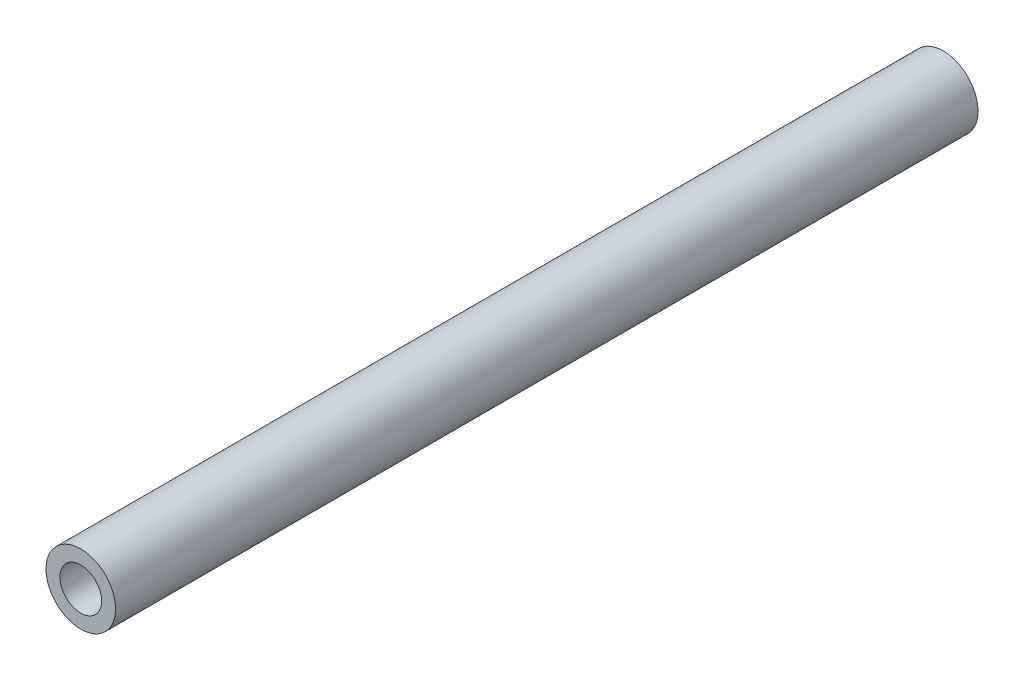
ISO-10303-21;
HEADER;
FILE_DESCRIPTION(('STEP AP214'),'2;1');
FILE_NAME('part.step','',(''),(''),'','','');
FILE_SCHEMA(('AUTOMOTIVE_DESIGN { 1 0 10303 214 1 1 1 1 }'));
ENDSEC;
DATA;
#1=APPLICATION_CONTEXT('core data for automotive mechanical design processes');
#2=APPLICATION_PROTOCOL_DEFINITION('international standard','automotive_design',2000,#1);
#3=PRODUCT_CONTEXT('',#1,'mechanical');
#4=PRODUCT('Part','Part','',(#3));
#5=PRODUCT_RELATED_PRODUCT_CATEGORY('part','',(#4));
#6=PRODUCT_DEFINITION_FORMATION('','',#4);
#7=PRODUCT_DEFINITION_CONTEXT('part definition',#1,'design');
#8=PRODUCT_DEFINITION('design','',#6,#7);
#9=PRODUCT_DEFINITION_SHAPE('','',#8);
#10=(LENGTH_UNIT() NAMED_UNIT(*) SI_UNIT(.MILLI.,.METRE.));
#11=(NAMED_UNIT(*) PLANE_ANGLE_UNIT() SI_UNIT($,.RADIAN.));
#12=(NAMED_UNIT(*) SI_UNIT($,.STERADIAN.) SOLID_ANGLE_UNIT());
#13=UNCERTAINTY_MEASURE_WITH_UNIT(LENGTH_MEASURE(1.E-05),#10,'distance_accuracy_value','');
#14=(GEOMETRIC_REPRESENTATION_CONTEXT(3) GLOBAL_UNCERTAINTY_ASSIGNED_CONTEXT((#13)) GLOBAL_UNIT_ASSIGNED_CONTEXT((#10,
#11,#12)) REPRESENTATION_CONTEXT('',''));
#15=CARTESIAN_POINT('',(0.,0.,0.));
#16=DIRECTION('',(0.,0.,1.));
#17=DIRECTION('',(1.,0.,0.));
#18=AXIS2_PLACEMENT_3D('',#15,#16,#17);
#19=CARTESIAN_POINT('',(0.,0.,124.));
#20=DIRECTION('',(0.,0.,-1.));
#21=DIRECTION('',(-1.,0.,0.));
#22=AXIS2_PLACEMENT_3D('',#19,#20,#21);
#23=CYLINDRICAL_SURFACE('',#22,3.);
#24=CARTESIAN_POINT('',(0.,0.,0.));
#25=DIRECTION('',(0.,0.,-1.));
#26=DIRECTION('',(-1.,0.,0.));
#27=AXIS2_PLACEMENT_3D('',#24,#25,#26);
#28=CIRCLE('',#27,3.);
#29=CARTESIAN_POINT('',(-3.,0.,0.));
#30=VERTEX_POINT('',#29);
#31=EDGE_CURVE('E27',#30,#30,#28,.T.);
#32=ORIENTED_EDGE('',*,*,#31,.T.);
#33=EDGE_LOOP('',(#32));
#34=FACE_BOUND('',#33,.T.);
#35=CARTESIAN_POINT('',(0.,0.,124.));
#36=DIRECTION('',(0.,0.,-1.));
#37=DIRECTION('',(-1.,0.,0.));
#38=AXIS2_PLACEMENT_3D('',#35,#36,#37);
#39=CIRCLE('',#38,3.);
#40=CARTESIAN_POINT('',(-3.,0.,124.));
#41=VERTEX_POINT('',#40);
#42=EDGE_CURVE('E18',#41,#41,#39,.T.);
#43=ORIENTED_EDGE('',*,*,#42,.F.);
#44=EDGE_LOOP('',(#43));
#45=FACE_BOUND('',#44,.T.);
#46=ADVANCED_FACE('F15',(#34,#45),#23,.F.);
#47=CARTESIAN_POINT('',(0.,0.,124.));
#48=DIRECTION('',(0.,0.,1.));
#49=DIRECTION('',(1.,0.,0.));
#50=AXIS2_PLACEMENT_3D('',#47,#48,#49);
#51=PLANE('',#50);
#52=ORIENTED_EDGE('',*,*,#42,.T.);
#53=EDGE_LOOP('',(#52));
#54=FACE_BOUND('',#53,.T.);
#55=CARTESIAN_POINT('',(0.,0.,124.));
#56=DIRECTION('',(0.,0.,-1.));
#57=DIRECTION('',(-1.,0.,0.));
#58=AXIS2_PLACEMENT_3D('',#55,#56,#57);
#59=CIRCLE('',#58,5.);
#60=CARTESIAN_POINT('',(-5.,0.,124.));
#61=VERTEX_POINT('',#60);
#62=EDGE_CURVE('E22',#61,#61,#59,.T.);
#63=ORIENTED_EDGE('',*,*,#62,.F.);
#64=EDGE_LOOP('',(#63));
#65=FACE_BOUND('',#64,.T.);
#66=ADVANCED_FACE('F35',(#54,#65),#51,.T.);
#67=CARTESIAN_POINT('',(0.,0.,0.));
#68=DIRECTION('',(0.,0.,1.));
#69=DIRECTION('',(1.,0.,0.));
#70=AXIS2_PLACEMENT_3D('',#67,#68,#69);
#71=PLANE('',#70);
#72=ORIENTED_EDGE('',*,*,#31,.F.);
#73=EDGE_LOOP('',(#72));
#74=FACE_BOUND('',#73,.T.);
#75=CARTESIAN_POINT('',(0.,0.,0.));
#76=DIRECTION('',(0.,0.,-1.));
#77=DIRECTION('',(-1.,0.,0.));
#78=AXIS2_PLACEMENT_3D('',#75,#76,#77);
#79=CIRCLE('',#78,5.);
#80=CARTESIAN_POINT('',(-5.,0.,0.));
#81=VERTEX_POINT('',#80);
#82=EDGE_CURVE('E10',#81,#81,#79,.F.);
#83=ORIENTED_EDGE('',*,*,#82,.F.);
#84=EDGE_LOOP('',(#83));
#85=FACE_BOUND('',#84,.T.);
#86=ADVANCED_FACE('F43',(#74,#85),#71,.F.);
#87=CARTESIAN_POINT('',(0.,0.,124.));
#88=DIRECTION('',(0.,0.,-1.));
#89=DIRECTION('',(-1.,0.,0.));
#90=AXIS2_PLACEMENT_3D('',#87,#88,#89);
#91=CYLINDRICAL_SURFACE('',#90,5.);
#92=ORIENTED_EDGE('',*,*,#82,.T.);
#93=EDGE_LOOP('',(#92));
#94=FACE_BOUND('',#93,.T.);
#95=ORIENTED_EDGE('',*,*,#62,.T.);
#96=EDGE_LOOP('',(#95));
#97=FACE_BOUND('',#96,.T.);
#98=ADVANCED_FACE('F44',(#94,#97),#91,.T.);
#99=CLOSED_SHELL('',(#46,#66,#86,#98));
#100=MANIFOLD_SOLID_BREP('B1',#99);
#101=ADVANCED_BREP_SHAPE_REPRESENTATION('',(#18,#100),#14);
#102=SHAPE_DEFINITION_REPRESENTATION(#9,#101);
ENDSEC;
END-ISO-10303-21;
